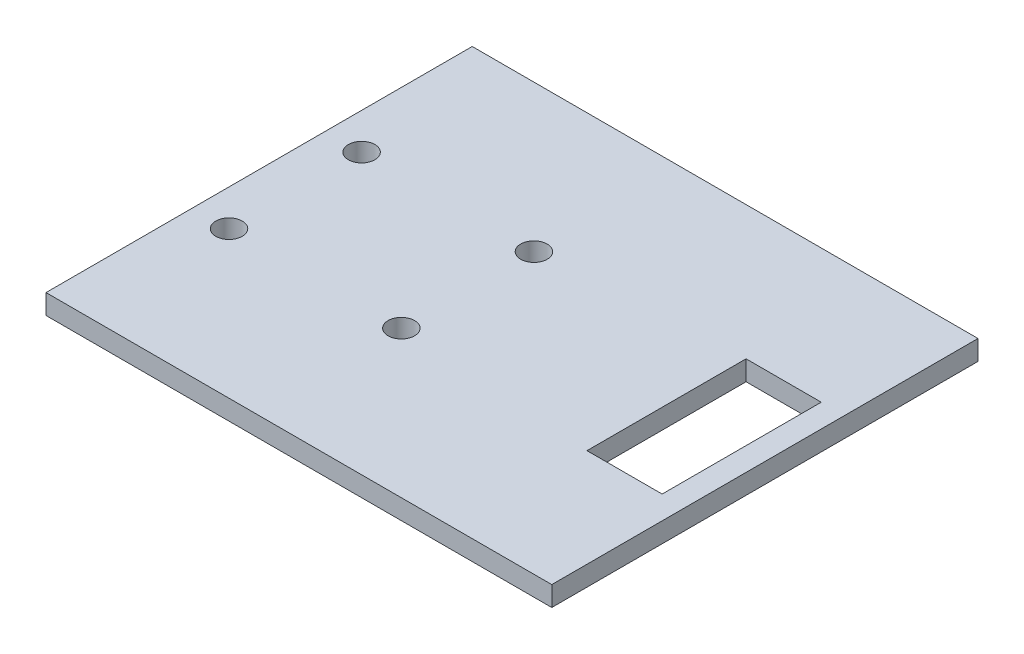
ISO-10303-21;
HEADER;
FILE_DESCRIPTION(('STEP AP214'),'2;1');
FILE_NAME('part.step','',(''),(''),'','','');
FILE_SCHEMA(('AUTOMOTIVE_DESIGN { 1 0 10303 214 1 1 1 1 }'));
ENDSEC;
DATA;
#1=APPLICATION_CONTEXT('core data for automotive mechanical design processes');
#2=APPLICATION_PROTOCOL_DEFINITION('international standard','automotive_design',2000,#1);
#3=PRODUCT_CONTEXT('',#1,'mechanical');
#4=PRODUCT('Part','Part','',(#3));
#5=PRODUCT_RELATED_PRODUCT_CATEGORY('part','',(#4));
#6=PRODUCT_DEFINITION_FORMATION('','',#4);
#7=PRODUCT_DEFINITION_CONTEXT('part definition',#1,'design');
#8=PRODUCT_DEFINITION('design','',#6,#7);
#9=PRODUCT_DEFINITION_SHAPE('','',#8);
#10=(LENGTH_UNIT() NAMED_UNIT(*) SI_UNIT(.MILLI.,.METRE.));
#11=(NAMED_UNIT(*) PLANE_ANGLE_UNIT() SI_UNIT($,.RADIAN.));
#12=(NAMED_UNIT(*) SI_UNIT($,.STERADIAN.) SOLID_ANGLE_UNIT());
#13=UNCERTAINTY_MEASURE_WITH_UNIT(LENGTH_MEASURE(1.E-05),#10,'distance_accuracy_value','');
#14=(GEOMETRIC_REPRESENTATION_CONTEXT(3) GLOBAL_UNCERTAINTY_ASSIGNED_CONTEXT((#13)) GLOBAL_UNIT_ASSIGNED_CONTEXT((#10,
#11,#12)) REPRESENTATION_CONTEXT('',''));
#15=CARTESIAN_POINT('',(0.,0.,0.));
#16=DIRECTION('',(0.,0.,1.));
#17=DIRECTION('',(1.,0.,0.));
#18=AXIS2_PLACEMENT_3D('',#15,#16,#17);
#19=CARTESIAN_POINT('',(0.,3.,0.));
#20=DIRECTION('',(1.,0.,0.));
#21=DIRECTION('',(0.,0.,-1.));
#22=AXIS2_PLACEMENT_3D('',#19,#20,#21);
#23=PLANE('',#22);
#24=DIRECTION('',(0.,0.,1.));
#25=VECTOR('',#24,1.);
#26=CARTESIAN_POINT('',(0.,0.,0.));
#27=LINE('',#26,#25);
#28=CARTESIAN_POINT('',(0.,0.,0.));
#29=VERTEX_POINT('',#28);
#30=CARTESIAN_POINT('',(0.,0.,64.3));
#31=VERTEX_POINT('',#30);
#32=EDGE_CURVE('E179',#29,#31,#27,.T.);
#33=ORIENTED_EDGE('',*,*,#32,.T.);
#34=DIRECTION('',(0.,-1.,0.));
#35=VECTOR('',#34,1.);
#36=CARTESIAN_POINT('',(0.,3.,64.3));
#37=LINE('',#36,#35);
#38=CARTESIAN_POINT('',(0.,3.,64.3));
#39=VERTEX_POINT('',#38);
#40=EDGE_CURVE('E11',#39,#31,#37,.T.);
#41=ORIENTED_EDGE('',*,*,#40,.F.);
#42=DIRECTION('',(0.,0.,1.));
#43=VECTOR('',#42,1.);
#44=CARTESIAN_POINT('',(0.,3.,0.));
#45=LINE('',#44,#43);
#46=CARTESIAN_POINT('',(0.,3.,0.));
#47=VERTEX_POINT('',#46);
#48=EDGE_CURVE('E183',#47,#39,#45,.T.);
#49=ORIENTED_EDGE('',*,*,#48,.F.);
#50=DIRECTION('',(0.,-1.,0.));
#51=VECTOR('',#50,1.);
#52=CARTESIAN_POINT('',(0.,3.,0.));
#53=LINE('',#52,#51);
#54=EDGE_CURVE('E197',#47,#29,#53,.T.);
#55=ORIENTED_EDGE('',*,*,#54,.T.);
#56=EDGE_LOOP('',(#33,#41,#49,#55));
#57=FACE_BOUND('',#56,.T.);
#58=ADVANCED_FACE('F47',(#57),#23,.F.);
#59=CARTESIAN_POINT('',(0.,3.,64.3));
#60=DIRECTION('',(0.,0.,-1.));
#61=DIRECTION('',(-1.,0.,0.));
#62=AXIS2_PLACEMENT_3D('',#59,#60,#61);
#63=PLANE('',#62);
#64=DIRECTION('',(1.,0.,0.));
#65=VECTOR('',#64,1.);
#66=CARTESIAN_POINT('',(0.,0.,64.3));
#67=LINE('',#66,#65);
#68=CARTESIAN_POINT('',(76.3,0.,64.3));
#69=VERTEX_POINT('',#68);
#70=EDGE_CURVE('E201',#31,#69,#67,.T.);
#71=ORIENTED_EDGE('',*,*,#70,.T.);
#72=DIRECTION('',(0.,-1.,0.));
#73=VECTOR('',#72,1.);
#74=CARTESIAN_POINT('',(76.3,3.,64.3));
#75=LINE('',#74,#73);
#76=CARTESIAN_POINT('',(76.3,3.,64.3));
#77=VERTEX_POINT('',#76);
#78=EDGE_CURVE('E55',#77,#69,#75,.T.);
#79=ORIENTED_EDGE('',*,*,#78,.F.);
#80=DIRECTION('',(1.,0.,0.));
#81=VECTOR('',#80,1.);
#82=CARTESIAN_POINT('',(0.,3.,64.3));
#83=LINE('',#82,#81);
#84=EDGE_CURVE('E187',#39,#77,#83,.T.);
#85=ORIENTED_EDGE('',*,*,#84,.F.);
#86=ORIENTED_EDGE('',*,*,#40,.T.);
#87=EDGE_LOOP('',(#71,#79,#85,#86));
#88=FACE_BOUND('',#87,.T.);
#89=ADVANCED_FACE('F236',(#88),#63,.F.);
#90=CARTESIAN_POINT('',(76.3,3.,0.));
#91=DIRECTION('',(-1.,0.,0.));
#92=DIRECTION('',(0.,0.,1.));
#93=AXIS2_PLACEMENT_3D('',#90,#91,#92);
#94=PLANE('',#93);
#95=DIRECTION('',(0.,0.,-1.));
#96=VECTOR('',#95,1.);
#97=CARTESIAN_POINT('',(76.3,0.,0.));
#98=LINE('',#97,#96);
#99=CARTESIAN_POINT('',(76.3,0.,0.));
#100=VERTEX_POINT('',#99);
#101=EDGE_CURVE('E204',#69,#100,#98,.T.);
#102=ORIENTED_EDGE('',*,*,#101,.T.);
#103=DIRECTION('',(0.,-1.,0.));
#104=VECTOR('',#103,1.);
#105=CARTESIAN_POINT('',(76.3,3.,0.));
#106=LINE('',#105,#104);
#107=CARTESIAN_POINT('',(76.3,3.,0.));
#108=VERTEX_POINT('',#107);
#109=EDGE_CURVE('E212',#108,#100,#106,.T.);
#110=ORIENTED_EDGE('',*,*,#109,.F.);
#111=DIRECTION('',(0.,0.,-1.));
#112=VECTOR('',#111,1.);
#113=CARTESIAN_POINT('',(76.3,3.,0.));
#114=LINE('',#113,#112);
#115=EDGE_CURVE('E191',#77,#108,#114,.T.);
#116=ORIENTED_EDGE('',*,*,#115,.F.);
#117=ORIENTED_EDGE('',*,*,#78,.T.);
#118=EDGE_LOOP('',(#102,#110,#116,#117));
#119=FACE_BOUND('',#118,.T.);
#120=ADVANCED_FACE('F221',(#119),#94,.F.);
#121=CARTESIAN_POINT('',(0.,3.,0.));
#122=DIRECTION('',(0.,0.,1.));
#123=DIRECTION('',(1.,0.,0.));
#124=AXIS2_PLACEMENT_3D('',#121,#122,#123);
#125=PLANE('',#124);
#126=DIRECTION('',(-1.,0.,0.));
#127=VECTOR('',#126,1.);
#128=CARTESIAN_POINT('',(0.,0.,0.));
#129=LINE('',#128,#127);
#130=EDGE_CURVE('E188',#100,#29,#129,.T.);
#131=ORIENTED_EDGE('',*,*,#130,.T.);
#132=ORIENTED_EDGE('',*,*,#54,.F.);
#133=DIRECTION('',(-1.,0.,0.));
#134=VECTOR('',#133,1.);
#135=CARTESIAN_POINT('',(0.,3.,0.));
#136=LINE('',#135,#134);
#137=EDGE_CURVE('E194',#108,#47,#136,.T.);
#138=ORIENTED_EDGE('',*,*,#137,.F.);
#139=ORIENTED_EDGE('',*,*,#109,.T.);
#140=EDGE_LOOP('',(#131,#132,#138,#139));
#141=FACE_BOUND('',#140,.T.);
#142=ADVANCED_FACE('F230',(#141),#125,.F.);
#143=CARTESIAN_POINT('',(0.,3.,0.));
#144=DIRECTION('',(0.,1.,0.));
#145=DIRECTION('',(0.,0.,1.));
#146=AXIS2_PLACEMENT_3D('',#143,#144,#145);
#147=PLANE('',#146);
#148=CARTESIAN_POINT('',(31.4598347625012,3.,22.15));
#149=DIRECTION('',(0.,1.,0.));
#150=DIRECTION('',(0.,0.,1.));
#151=AXIS2_PLACEMENT_3D('',#148,#149,#150);
#152=CIRCLE('',#151,2.00000000000001);
#153=CARTESIAN_POINT('',(31.4598347625012,3.,24.15));
#154=VERTEX_POINT('',#153);
#155=EDGE_CURVE('E158',#154,#154,#152,.T.);
#156=ORIENTED_EDGE('',*,*,#155,.F.);
#157=EDGE_LOOP('',(#156));
#158=FACE_BOUND('',#157,.T.);
#159=CARTESIAN_POINT('',(5.45983476250122,3.,42.15));
#160=DIRECTION('',(0.,1.,0.));
#161=DIRECTION('',(0.,0.,1.));
#162=AXIS2_PLACEMENT_3D('',#159,#160,#161);
#163=CIRCLE('',#162,2.);
#164=CARTESIAN_POINT('',(5.45983476250122,3.,44.15));
#165=VERTEX_POINT('',#164);
#166=EDGE_CURVE('E167',#165,#165,#163,.T.);
#167=ORIENTED_EDGE('',*,*,#166,.F.);
#168=EDGE_LOOP('',(#167));
#169=FACE_BOUND('',#168,.T.);
#170=CARTESIAN_POINT('',(31.4598347625012,3.,42.15));
#171=DIRECTION('',(0.,1.,0.));
#172=DIRECTION('',(0.,0.,1.));
#173=AXIS2_PLACEMENT_3D('',#170,#171,#172);
#174=CIRCLE('',#173,2.);
#175=CARTESIAN_POINT('',(31.4598347625012,3.,44.15));
#176=VERTEX_POINT('',#175);
#177=EDGE_CURVE('E141',#176,#176,#174,.T.);
#178=ORIENTED_EDGE('',*,*,#177,.F.);
#179=EDGE_LOOP('',(#178));
#180=FACE_BOUND('',#179,.T.);
#181=DIRECTION('',(0.,0.,1.));
#182=VECTOR('',#181,1.);
#183=CARTESIAN_POINT('',(61.4598347625012,3.,20.15));
#184=LINE('',#183,#182);
#185=CARTESIAN_POINT('',(61.4598347625012,3.,20.15));
#186=VERTEX_POINT('',#185);
#187=CARTESIAN_POINT('',(61.4598347625012,3.,44.15));
#188=VERTEX_POINT('',#187);
#189=EDGE_CURVE('E62',#186,#188,#184,.T.);
#190=ORIENTED_EDGE('',*,*,#189,.F.);
#191=DIRECTION('',(-1.,0.,0.));
#192=VECTOR('',#191,1.);
#193=CARTESIAN_POINT('',(61.4598347625012,3.,20.15));
#194=LINE('',#193,#192);
#195=CARTESIAN_POINT('',(72.8,3.,20.15));
#196=VERTEX_POINT('',#195);
#197=EDGE_CURVE('E122',#196,#186,#194,.T.);
#198=ORIENTED_EDGE('',*,*,#197,.F.);
#199=DIRECTION('',(0.,0.,-1.));
#200=VECTOR('',#199,1.);
#201=CARTESIAN_POINT('',(72.8,3.,20.15));
#202=LINE('',#201,#200);
#203=CARTESIAN_POINT('',(72.8,3.,44.15));
#204=VERTEX_POINT('',#203);
#205=EDGE_CURVE('E128',#204,#196,#202,.T.);
#206=ORIENTED_EDGE('',*,*,#205,.F.);
#207=DIRECTION('',(1.,0.,0.));
#208=VECTOR('',#207,1.);
#209=CARTESIAN_POINT('',(61.4598347625012,3.,44.15));
#210=LINE('',#209,#208);
#211=EDGE_CURVE('E134',#188,#204,#210,.T.);
#212=ORIENTED_EDGE('',*,*,#211,.F.);
#213=EDGE_LOOP('',(#190,#198,#206,#212));
#214=FACE_BOUND('',#213,.T.);
#215=CARTESIAN_POINT('',(5.45983476250122,3.,22.15));
#216=DIRECTION('',(0.,1.,0.));
#217=DIRECTION('',(0.,0.,1.));
#218=AXIS2_PLACEMENT_3D('',#215,#216,#217);
#219=CIRCLE('',#218,2.);
#220=CARTESIAN_POINT('',(5.45983476250122,3.,24.15));
#221=VERTEX_POINT('',#220);
#222=EDGE_CURVE('E162',#221,#221,#219,.T.);
#223=ORIENTED_EDGE('',*,*,#222,.F.);
#224=EDGE_LOOP('',(#223));
#225=FACE_BOUND('',#224,.T.);
#226=ORIENTED_EDGE('',*,*,#48,.T.);
#227=ORIENTED_EDGE('',*,*,#84,.T.);
#228=ORIENTED_EDGE('',*,*,#115,.T.);
#229=ORIENTED_EDGE('',*,*,#137,.T.);
#230=EDGE_LOOP('',(#226,#227,#228,#229));
#231=FACE_BOUND('',#230,.T.);
#232=ADVANCED_FACE('F131',(#158,#169,#180,#214,#225,#231),#147,.T.);
#233=CARTESIAN_POINT('',(0.,0.,0.));
#234=DIRECTION('',(0.,1.,0.));
#235=DIRECTION('',(0.,0.,1.));
#236=AXIS2_PLACEMENT_3D('',#233,#234,#235);
#237=PLANE('',#236);
#238=CARTESIAN_POINT('',(31.4598347625012,0.,22.15));
#239=DIRECTION('',(0.,1.,0.));
#240=DIRECTION('',(0.,0.,1.));
#241=AXIS2_PLACEMENT_3D('',#238,#239,#240);
#242=CIRCLE('',#241,2.00000000000001);
#243=CARTESIAN_POINT('',(31.4598347625012,0.,24.15));
#244=VERTEX_POINT('',#243);
#245=EDGE_CURVE('E163',#244,#244,#242,.T.);
#246=ORIENTED_EDGE('',*,*,#245,.T.);
#247=EDGE_LOOP('',(#246));
#248=FACE_BOUND('',#247,.T.);
#249=CARTESIAN_POINT('',(5.45983476250122,0.,42.15));
#250=DIRECTION('',(0.,1.,0.));
#251=DIRECTION('',(0.,0.,1.));
#252=AXIS2_PLACEMENT_3D('',#249,#250,#251);
#253=CIRCLE('',#252,2.);
#254=CARTESIAN_POINT('',(5.45983476250122,0.,44.15));
#255=VERTEX_POINT('',#254);
#256=EDGE_CURVE('E171',#255,#255,#253,.T.);
#257=ORIENTED_EDGE('',*,*,#256,.T.);
#258=EDGE_LOOP('',(#257));
#259=FACE_BOUND('',#258,.T.);
#260=CARTESIAN_POINT('',(31.4598347625012,0.,42.15));
#261=DIRECTION('',(0.,1.,0.));
#262=DIRECTION('',(0.,0.,1.));
#263=AXIS2_PLACEMENT_3D('',#260,#261,#262);
#264=CIRCLE('',#263,2.);
#265=CARTESIAN_POINT('',(31.4598347625012,0.,44.15));
#266=VERTEX_POINT('',#265);
#267=EDGE_CURVE('E136',#266,#266,#264,.T.);
#268=ORIENTED_EDGE('',*,*,#267,.T.);
#269=EDGE_LOOP('',(#268));
#270=FACE_BOUND('',#269,.T.);
#271=DIRECTION('',(-1.,0.,0.));
#272=VECTOR('',#271,1.);
#273=CARTESIAN_POINT('',(61.4598347625012,0.,20.15));
#274=LINE('',#273,#272);
#275=CARTESIAN_POINT('',(72.8,0.,20.15));
#276=VERTEX_POINT('',#275);
#277=CARTESIAN_POINT('',(61.4598347625012,0.,20.15));
#278=VERTEX_POINT('',#277);
#279=EDGE_CURVE('E146',#276,#278,#274,.T.);
#280=ORIENTED_EDGE('',*,*,#279,.T.);
#281=DIRECTION('',(0.,0.,1.));
#282=VECTOR('',#281,1.);
#283=CARTESIAN_POINT('',(61.4598347625012,0.,20.15));
#284=LINE('',#283,#282);
#285=CARTESIAN_POINT('',(61.4598347625012,0.,44.15));
#286=VERTEX_POINT('',#285);
#287=EDGE_CURVE('E114',#278,#286,#284,.T.);
#288=ORIENTED_EDGE('',*,*,#287,.T.);
#289=DIRECTION('',(1.,0.,0.));
#290=VECTOR('',#289,1.);
#291=CARTESIAN_POINT('',(61.4598347625012,0.,44.15));
#292=LINE('',#291,#290);
#293=CARTESIAN_POINT('',(72.8,0.,44.15));
#294=VERTEX_POINT('',#293);
#295=EDGE_CURVE('E152',#286,#294,#292,.T.);
#296=ORIENTED_EDGE('',*,*,#295,.T.);
#297=DIRECTION('',(0.,0.,-1.));
#298=VECTOR('',#297,1.);
#299=CARTESIAN_POINT('',(72.8,0.,20.15));
#300=LINE('',#299,#298);
#301=EDGE_CURVE('E70',#294,#276,#300,.T.);
#302=ORIENTED_EDGE('',*,*,#301,.T.);
#303=EDGE_LOOP('',(#280,#288,#296,#302));
#304=FACE_BOUND('',#303,.T.);
#305=CARTESIAN_POINT('',(5.45983476250122,0.,22.15));
#306=DIRECTION('',(0.,1.,0.));
#307=DIRECTION('',(0.,0.,1.));
#308=AXIS2_PLACEMENT_3D('',#305,#306,#307);
#309=CIRCLE('',#308,2.);
#310=CARTESIAN_POINT('',(5.45983476250122,0.,24.15));
#311=VERTEX_POINT('',#310);
#312=EDGE_CURVE('E175',#311,#311,#309,.T.);
#313=ORIENTED_EDGE('',*,*,#312,.T.);
#314=EDGE_LOOP('',(#313));
#315=FACE_BOUND('',#314,.T.);
#316=ORIENTED_EDGE('',*,*,#32,.F.);
#317=ORIENTED_EDGE('',*,*,#130,.F.);
#318=ORIENTED_EDGE('',*,*,#101,.F.);
#319=ORIENTED_EDGE('',*,*,#70,.F.);
#320=EDGE_LOOP('',(#316,#317,#318,#319));
#321=FACE_BOUND('',#320,.T.);
#322=ADVANCED_FACE('F227',(#248,#259,#270,#304,#315,#321),#237,.F.);
#323=CARTESIAN_POINT('',(5.45983476250122,0.,22.15));
#324=DIRECTION('',(0.,1.,0.));
#325=DIRECTION('',(0.,0.,1.));
#326=AXIS2_PLACEMENT_3D('',#323,#324,#325);
#327=CYLINDRICAL_SURFACE('',#326,2.);
#328=ORIENTED_EDGE('',*,*,#312,.F.);
#329=EDGE_LOOP('',(#328));
#330=FACE_BOUND('',#329,.T.);
#331=ORIENTED_EDGE('',*,*,#222,.T.);
#332=EDGE_LOOP('',(#331));
#333=FACE_BOUND('',#332,.T.);
#334=ADVANCED_FACE('F248',(#330,#333),#327,.F.);
#335=CARTESIAN_POINT('',(61.4598347625012,0.,20.15));
#336=DIRECTION('',(-1.,0.,0.));
#337=DIRECTION('',(0.,0.,1.));
#338=AXIS2_PLACEMENT_3D('',#335,#336,#337);
#339=PLANE('',#338);
#340=ORIENTED_EDGE('',*,*,#189,.T.);
#341=DIRECTION('',(0.,1.,0.));
#342=VECTOR('',#341,1.);
#343=CARTESIAN_POINT('',(61.4598347625012,0.,44.15));
#344=LINE('',#343,#342);
#345=EDGE_CURVE('E149',#286,#188,#344,.T.);
#346=ORIENTED_EDGE('',*,*,#345,.F.);
#347=ORIENTED_EDGE('',*,*,#287,.F.);
#348=DIRECTION('',(0.,1.,0.));
#349=VECTOR('',#348,1.);
#350=CARTESIAN_POINT('',(61.4598347625012,0.,20.15));
#351=LINE('',#350,#349);
#352=EDGE_CURVE('E110',#278,#186,#351,.T.);
#353=ORIENTED_EDGE('',*,*,#352,.T.);
#354=EDGE_LOOP('',(#340,#346,#347,#353));
#355=FACE_BOUND('',#354,.T.);
#356=ADVANCED_FACE('F112',(#355),#339,.F.);
#357=CARTESIAN_POINT('',(61.4598347625012,0.,20.15));
#358=DIRECTION('',(0.,0.,-1.));
#359=DIRECTION('',(-1.,0.,0.));
#360=AXIS2_PLACEMENT_3D('',#357,#358,#359);
#361=PLANE('',#360);
#362=ORIENTED_EDGE('',*,*,#197,.T.);
#363=ORIENTED_EDGE('',*,*,#352,.F.);
#364=ORIENTED_EDGE('',*,*,#279,.F.);
#365=DIRECTION('',(0.,1.,0.));
#366=VECTOR('',#365,1.);
#367=CARTESIAN_POINT('',(72.8,0.,20.15));
#368=LINE('',#367,#366);
#369=EDGE_CURVE('E119',#276,#196,#368,.T.);
#370=ORIENTED_EDGE('',*,*,#369,.T.);
#371=EDGE_LOOP('',(#362,#363,#364,#370));
#372=FACE_BOUND('',#371,.T.);
#373=ADVANCED_FACE('F123',(#372),#361,.F.);
#374=CARTESIAN_POINT('',(72.8,0.,20.15));
#375=DIRECTION('',(1.,0.,0.));
#376=DIRECTION('',(0.,0.,-1.));
#377=AXIS2_PLACEMENT_3D('',#374,#375,#376);
#378=PLANE('',#377);
#379=ORIENTED_EDGE('',*,*,#205,.T.);
#380=ORIENTED_EDGE('',*,*,#369,.F.);
#381=ORIENTED_EDGE('',*,*,#301,.F.);
#382=DIRECTION('',(0.,1.,0.));
#383=VECTOR('',#382,1.);
#384=CARTESIAN_POINT('',(72.8,0.,44.15));
#385=LINE('',#384,#383);
#386=EDGE_CURVE('E290',#294,#204,#385,.T.);
#387=ORIENTED_EDGE('',*,*,#386,.T.);
#388=EDGE_LOOP('',(#379,#380,#381,#387));
#389=FACE_BOUND('',#388,.T.);
#390=ADVANCED_FACE('F267',(#389),#378,.F.);
#391=CARTESIAN_POINT('',(61.4598347625012,0.,44.15));
#392=DIRECTION('',(0.,0.,1.));
#393=DIRECTION('',(1.,0.,0.));
#394=AXIS2_PLACEMENT_3D('',#391,#392,#393);
#395=PLANE('',#394);
#396=ORIENTED_EDGE('',*,*,#211,.T.);
#397=ORIENTED_EDGE('',*,*,#386,.F.);
#398=ORIENTED_EDGE('',*,*,#295,.F.);
#399=ORIENTED_EDGE('',*,*,#345,.T.);
#400=EDGE_LOOP('',(#396,#397,#398,#399));
#401=FACE_BOUND('',#400,.T.);
#402=ADVANCED_FACE('F270',(#401),#395,.F.);
#403=CARTESIAN_POINT('',(31.4598347625012,0.,42.15));
#404=DIRECTION('',(0.,1.,0.));
#405=DIRECTION('',(0.,0.,1.));
#406=AXIS2_PLACEMENT_3D('',#403,#404,#405);
#407=CYLINDRICAL_SURFACE('',#406,2.);
#408=ORIENTED_EDGE('',*,*,#267,.F.);
#409=EDGE_LOOP('',(#408));
#410=FACE_BOUND('',#409,.T.);
#411=ORIENTED_EDGE('',*,*,#177,.T.);
#412=EDGE_LOOP('',(#411));
#413=FACE_BOUND('',#412,.T.);
#414=ADVANCED_FACE('F260',(#410,#413),#407,.F.);
#415=CARTESIAN_POINT('',(5.45983476250122,0.,42.15));
#416=DIRECTION('',(0.,1.,0.));
#417=DIRECTION('',(0.,0.,1.));
#418=AXIS2_PLACEMENT_3D('',#415,#416,#417);
#419=CYLINDRICAL_SURFACE('',#418,2.);
#420=ORIENTED_EDGE('',*,*,#256,.F.);
#421=EDGE_LOOP('',(#420));
#422=FACE_BOUND('',#421,.T.);
#423=ORIENTED_EDGE('',*,*,#166,.T.);
#424=EDGE_LOOP('',(#423));
#425=FACE_BOUND('',#424,.T.);
#426=ADVANCED_FACE('F256',(#422,#425),#419,.F.);
#427=CARTESIAN_POINT('',(31.4598347625012,0.,22.15));
#428=DIRECTION('',(0.,1.,0.));
#429=DIRECTION('',(0.,0.,1.));
#430=AXIS2_PLACEMENT_3D('',#427,#428,#429);
#431=CYLINDRICAL_SURFACE('',#430,2.00000000000001);
#432=ORIENTED_EDGE('',*,*,#245,.F.);
#433=EDGE_LOOP('',(#432));
#434=FACE_BOUND('',#433,.T.);
#435=ORIENTED_EDGE('',*,*,#155,.T.);
#436=EDGE_LOOP('',(#435));
#437=FACE_BOUND('',#436,.T.);
#438=ADVANCED_FACE('F259',(#434,#437),#431,.F.);
#439=CLOSED_SHELL('',(#58,#89,#120,#142,#232,#322,#334,#356,#373,#390,#402,#414,#426,#438));
#440=MANIFOLD_SOLID_BREP('B2',#439);
#441=ADVANCED_BREP_SHAPE_REPRESENTATION('',(#18,#440),#14);
#442=SHAPE_DEFINITION_REPRESENTATION(#9,#441);
ENDSEC;
END-ISO-10303-21;
